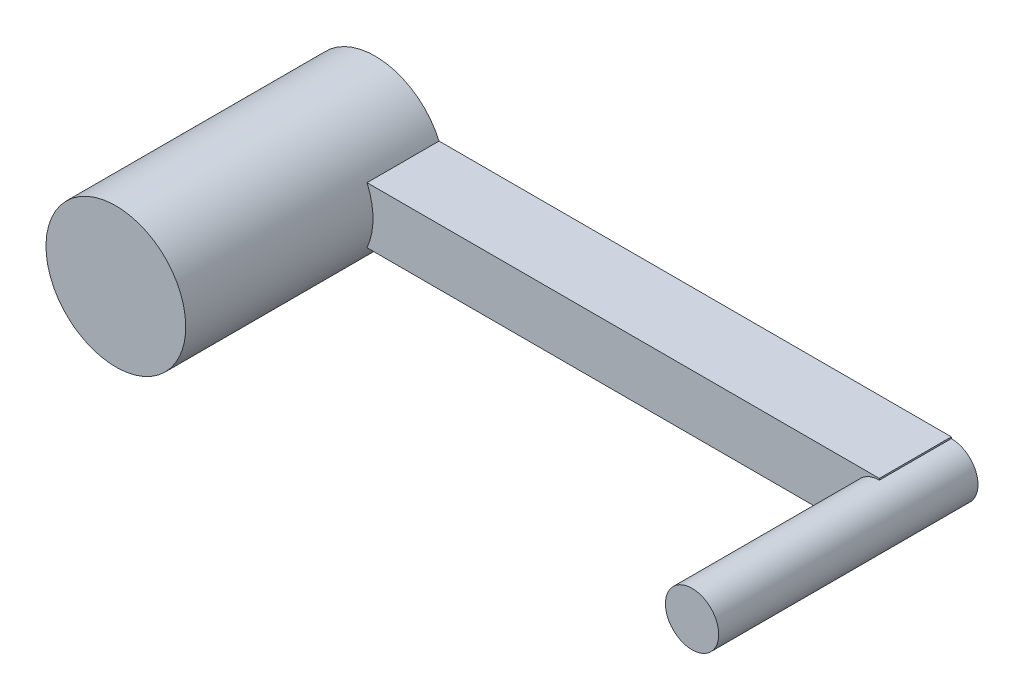
ISO-10303-21;
HEADER;
FILE_DESCRIPTION(('STEP AP214'),'2;1');
FILE_NAME('part.step','',(''),(''),'','','');
FILE_SCHEMA(('AUTOMOTIVE_DESIGN { 1 0 10303 214 1 1 1 1 }'));
ENDSEC;
DATA;
#1=APPLICATION_CONTEXT('core data for automotive mechanical design processes');
#2=APPLICATION_PROTOCOL_DEFINITION('international standard','automotive_design',2000,#1);
#3=PRODUCT_CONTEXT('',#1,'mechanical');
#4=PRODUCT('Part','Part','',(#3));
#5=PRODUCT_RELATED_PRODUCT_CATEGORY('part','',(#4));
#6=PRODUCT_DEFINITION_FORMATION('','',#4);
#7=PRODUCT_DEFINITION_CONTEXT('part definition',#1,'design');
#8=PRODUCT_DEFINITION('design','',#6,#7);
#9=PRODUCT_DEFINITION_SHAPE('','',#8);
#10=(LENGTH_UNIT() NAMED_UNIT(*) SI_UNIT(.MILLI.,.METRE.));
#11=(NAMED_UNIT(*) PLANE_ANGLE_UNIT() SI_UNIT($,.RADIAN.));
#12=(NAMED_UNIT(*) SI_UNIT($,.STERADIAN.) SOLID_ANGLE_UNIT());
#13=UNCERTAINTY_MEASURE_WITH_UNIT(LENGTH_MEASURE(1.E-05),#10,'distance_accuracy_value','');
#14=(GEOMETRIC_REPRESENTATION_CONTEXT(3) GLOBAL_UNCERTAINTY_ASSIGNED_CONTEXT((#13)) GLOBAL_UNIT_ASSIGNED_CONTEXT((#10,
#11,#12)) REPRESENTATION_CONTEXT('',''));
#15=CARTESIAN_POINT('',(0.,0.,0.));
#16=DIRECTION('',(0.,0.,1.));
#17=DIRECTION('',(1.,0.,0.));
#18=AXIS2_PLACEMENT_3D('',#15,#16,#17);
#19=CARTESIAN_POINT('',(40.,0.,5.));
#20=DIRECTION('',(1.,0.,0.));
#21=DIRECTION('',(0.,0.,-1.));
#22=AXIS2_PLACEMENT_3D('',#19,#20,#21);
#23=PLANE('',#22);
#24=DIRECTION('',(0.,-1.,0.));
#25=VECTOR('',#24,1.);
#26=CARTESIAN_POINT('',(40.,0.,0.));
#27=LINE('',#26,#25);
#28=CARTESIAN_POINT('',(40.,0.,0.));
#29=VERTEX_POINT('',#28);
#30=CARTESIAN_POINT('',(40.,-0.106521739130443,0.));
#31=VERTEX_POINT('',#30);
#32=EDGE_CURVE('E97',#29,#31,#27,.T.);
#33=ORIENTED_EDGE('',*,*,#32,.F.);
#34=DIRECTION('',(0.,0.,-1.));
#35=VECTOR('',#34,1.);
#36=CARTESIAN_POINT('',(40.,0.,5.));
#37=LINE('',#36,#35);
#38=CARTESIAN_POINT('',(40.,0.,5.));
#39=VERTEX_POINT('',#38);
#40=EDGE_CURVE('E57',#39,#29,#37,.T.);
#41=ORIENTED_EDGE('',*,*,#40,.F.);
#42=DIRECTION('',(0.,-1.,0.));
#43=VECTOR('',#42,1.);
#44=CARTESIAN_POINT('',(40.,0.,5.));
#45=LINE('',#44,#43);
#46=CARTESIAN_POINT('',(40.,-0.106521739130443,5.));
#47=VERTEX_POINT('',#46);
#48=EDGE_CURVE('E120',#39,#47,#45,.T.);
#49=ORIENTED_EDGE('',*,*,#48,.T.);
#50=DIRECTION('',(0.,0.,-1.));
#51=VECTOR('',#50,1.);
#52=CARTESIAN_POINT('',(40.,-0.106521739130443,5.));
#53=LINE('',#52,#51);
#54=EDGE_CURVE('E11',#47,#31,#53,.T.);
#55=ORIENTED_EDGE('',*,*,#54,.T.);
#56=EDGE_LOOP('',(#33,#41,#49,#55));
#57=FACE_BOUND('',#56,.T.);
#58=ADVANCED_FACE('F47',(#57),#23,.T.);
#59=CARTESIAN_POINT('',(0.,0.,5.));
#60=DIRECTION('',(0.,1.,0.));
#61=DIRECTION('',(0.,0.,1.));
#62=AXIS2_PLACEMENT_3D('',#59,#60,#61);
#63=PLANE('',#62);
#64=DIRECTION('',(1.,0.,0.));
#65=VECTOR('',#64,1.);
#66=CARTESIAN_POINT('',(0.,0.,0.));
#67=LINE('',#66,#65);
#68=CARTESIAN_POINT('',(4.43785113363551,0.,0.));
#69=VERTEX_POINT('',#68);
#70=EDGE_CURVE('E122',#69,#29,#67,.T.);
#71=ORIENTED_EDGE('',*,*,#70,.F.);
#72=DIRECTION('',(0.,0.,-1.));
#73=VECTOR('',#72,1.);
#74=CARTESIAN_POINT('',(4.43785113363551,0.,5.));
#75=LINE('',#74,#73);
#76=CARTESIAN_POINT('',(4.43785113363551,0.,5.));
#77=VERTEX_POINT('',#76);
#78=EDGE_CURVE('E174',#77,#69,#75,.T.);
#79=ORIENTED_EDGE('',*,*,#78,.F.);
#80=DIRECTION('',(1.,0.,0.));
#81=VECTOR('',#80,1.);
#82=CARTESIAN_POINT('',(0.,0.,5.));
#83=LINE('',#82,#81);
#84=EDGE_CURVE('E145',#77,#39,#83,.T.);
#85=ORIENTED_EDGE('',*,*,#84,.T.);
#86=ORIENTED_EDGE('',*,*,#40,.T.);
#87=EDGE_LOOP('',(#71,#79,#85,#86));
#88=FACE_BOUND('',#87,.T.);
#89=ADVANCED_FACE('F49',(#88),#63,.T.);
#90=CARTESIAN_POINT('',(0.,-3.91304347826088,5.));
#91=DIRECTION('',(0.,1.,0.));
#92=DIRECTION('',(0.,0.,1.));
#93=AXIS2_PLACEMENT_3D('',#90,#91,#92);
#94=PLANE('',#93);
#95=DIRECTION('',(1.,0.,0.));
#96=VECTOR('',#95,1.);
#97=CARTESIAN_POINT('',(0.,-3.91304347826088,0.));
#98=LINE('',#97,#96);
#99=CARTESIAN_POINT('',(4.43785113363551,-3.91304347826088,0.));
#100=VERTEX_POINT('',#99);
#101=CARTESIAN_POINT('',(40.,-3.91304347826088,0.));
#102=VERTEX_POINT('',#101);
#103=EDGE_CURVE('E116',#100,#102,#98,.T.);
#104=ORIENTED_EDGE('',*,*,#103,.T.);
#105=DIRECTION('',(0.,0.,-1.));
#106=VECTOR('',#105,1.);
#107=CARTESIAN_POINT('',(40.,-3.91304347826088,5.));
#108=LINE('',#107,#106);
#109=CARTESIAN_POINT('',(40.,-3.91304347826088,5.));
#110=VERTEX_POINT('',#109);
#111=EDGE_CURVE('E82',#110,#102,#108,.T.);
#112=ORIENTED_EDGE('',*,*,#111,.F.);
#113=DIRECTION('',(1.,0.,0.));
#114=VECTOR('',#113,1.);
#115=CARTESIAN_POINT('',(0.,-3.91304347826088,5.));
#116=LINE('',#115,#114);
#117=CARTESIAN_POINT('',(4.43785113363551,-3.91304347826088,5.));
#118=VERTEX_POINT('',#117);
#119=EDGE_CURVE('E65',#118,#110,#116,.T.);
#120=ORIENTED_EDGE('',*,*,#119,.F.);
#121=DIRECTION('',(0.,0.,-1.));
#122=VECTOR('',#121,1.);
#123=CARTESIAN_POINT('',(4.43785113363551,-3.91304347826088,5.));
#124=LINE('',#123,#122);
#125=EDGE_CURVE('E167',#118,#100,#124,.T.);
#126=ORIENTED_EDGE('',*,*,#125,.T.);
#127=EDGE_LOOP('',(#104,#112,#120,#126));
#128=FACE_BOUND('',#127,.T.);
#129=ADVANCED_FACE('F176',(#128),#94,.F.);
#130=CARTESIAN_POINT('',(40.,-3.80652173913044,0.));
#131=VERTEX_POINT('',#130);
#132=EDGE_CURVE('E93',#131,#102,#27,.T.);
#133=ORIENTED_EDGE('',*,*,#132,.F.);
#134=DIRECTION('',(0.,0.,-1.));
#135=VECTOR('',#134,1.);
#136=CARTESIAN_POINT('',(40.,-3.80652173913044,5.));
#137=LINE('',#136,#135);
#138=CARTESIAN_POINT('',(40.,-3.80652173913044,5.));
#139=VERTEX_POINT('',#138);
#140=EDGE_CURVE('E105',#139,#131,#137,.T.);
#141=ORIENTED_EDGE('',*,*,#140,.F.);
#142=EDGE_CURVE('E112',#139,#110,#45,.T.);
#143=ORIENTED_EDGE('',*,*,#142,.T.);
#144=ORIENTED_EDGE('',*,*,#111,.T.);
#145=EDGE_LOOP('',(#133,#141,#143,#144));
#146=FACE_BOUND('',#145,.T.);
#147=ADVANCED_FACE('F114',(#146),#23,.T.);
#148=CARTESIAN_POINT('',(0.,0.,5.));
#149=DIRECTION('',(0.,0.,1.));
#150=DIRECTION('',(1.,0.,0.));
#151=AXIS2_PLACEMENT_3D('',#148,#149,#150);
#152=PLANE('',#151);
#153=CARTESIAN_POINT('',(40.,-1.95652173913044,5.));
#154=DIRECTION('',(0.,0.,1.));
#155=DIRECTION('',(1.,0.,0.));
#156=AXIS2_PLACEMENT_3D('',#153,#154,#155);
#157=CIRCLE('',#156,1.85);
#158=EDGE_CURVE('E110',#47,#139,#157,.T.);
#159=ORIENTED_EDGE('',*,*,#158,.F.);
#160=ORIENTED_EDGE('',*,*,#48,.F.);
#161=ORIENTED_EDGE('',*,*,#84,.F.);
#162=CARTESIAN_POINT('',(0.,-1.95652173913044,5.));
#163=DIRECTION('',(0.,0.,1.));
#164=DIRECTION('',(1.,0.,0.));
#165=AXIS2_PLACEMENT_3D('',#162,#163,#164);
#166=CIRCLE('',#165,4.85);
#167=EDGE_CURVE('E149',#118,#77,#166,.T.);
#168=ORIENTED_EDGE('',*,*,#167,.F.);
#169=ORIENTED_EDGE('',*,*,#119,.T.);
#170=ORIENTED_EDGE('',*,*,#142,.F.);
#171=EDGE_LOOP('',(#159,#160,#161,#168,#169,#170));
#172=FACE_BOUND('',#171,.T.);
#173=ADVANCED_FACE('F154',(#172),#152,.T.);
#174=CARTESIAN_POINT('',(0.,0.,0.));
#175=DIRECTION('',(0.,0.,1.));
#176=DIRECTION('',(1.,0.,0.));
#177=AXIS2_PLACEMENT_3D('',#174,#175,#176);
#178=PLANE('',#177);
#179=ORIENTED_EDGE('',*,*,#32,.T.);
#180=CARTESIAN_POINT('',(40.,-1.95652173913044,0.));
#181=DIRECTION('',(0.,0.,1.));
#182=DIRECTION('',(1.,0.,0.));
#183=AXIS2_PLACEMENT_3D('',#180,#181,#182);
#184=CIRCLE('',#183,1.85);
#185=EDGE_CURVE('E89',#131,#31,#184,.T.);
#186=ORIENTED_EDGE('',*,*,#185,.F.);
#187=ORIENTED_EDGE('',*,*,#132,.T.);
#188=ORIENTED_EDGE('',*,*,#103,.F.);
#189=CARTESIAN_POINT('',(0.,-1.95652173913044,0.));
#190=DIRECTION('',(0.,0.,1.));
#191=DIRECTION('',(1.,0.,0.));
#192=AXIS2_PLACEMENT_3D('',#189,#190,#191);
#193=CIRCLE('',#192,4.85);
#194=EDGE_CURVE('E131',#69,#100,#193,.T.);
#195=ORIENTED_EDGE('',*,*,#194,.F.);
#196=ORIENTED_EDGE('',*,*,#70,.T.);
#197=EDGE_LOOP('',(#179,#186,#187,#188,#195,#196));
#198=FACE_BOUND('',#197,.T.);
#199=ADVANCED_FACE('F91',(#198),#178,.F.);
#200=CARTESIAN_POINT('',(40.,-1.95652173913044,18.));
#201=DIRECTION('',(0.,0.,-1.));
#202=DIRECTION('',(-1.,0.,0.));
#203=AXIS2_PLACEMENT_3D('',#200,#201,#202);
#204=CYLINDRICAL_SURFACE('',#203,1.85);
#205=ORIENTED_EDGE('',*,*,#54,.F.);
#206=ORIENTED_EDGE('',*,*,#158,.T.);
#207=ORIENTED_EDGE('',*,*,#140,.T.);
#208=ORIENTED_EDGE('',*,*,#185,.T.);
#209=EDGE_LOOP('',(#205,#206,#207,#208));
#210=FACE_BOUND('',#209,.T.);
#211=CARTESIAN_POINT('',(40.,-1.95652173913044,18.));
#212=DIRECTION('',(0.,0.,1.));
#213=DIRECTION('',(1.,0.,0.));
#214=AXIS2_PLACEMENT_3D('',#211,#212,#213);
#215=CIRCLE('',#214,1.85);
#216=CARTESIAN_POINT('',(41.85,-1.95652173913044,18.));
#217=VERTEX_POINT('',#216);
#218=EDGE_CURVE('E101',#217,#217,#215,.T.);
#219=ORIENTED_EDGE('',*,*,#218,.F.);
#220=EDGE_LOOP('',(#219));
#221=FACE_BOUND('',#220,.T.);
#222=ADVANCED_FACE('F106',(#210,#221),#204,.T.);
#223=CARTESIAN_POINT('',(0.,0.,18.));
#224=DIRECTION('',(0.,0.,1.));
#225=DIRECTION('',(1.,0.,0.));
#226=AXIS2_PLACEMENT_3D('',#223,#224,#225);
#227=PLANE('',#226);
#228=ORIENTED_EDGE('',*,*,#218,.T.);
#229=EDGE_LOOP('',(#228));
#230=FACE_BOUND('',#229,.T.);
#231=ADVANCED_FACE('F236',(#230),#227,.T.);
#232=CARTESIAN_POINT('',(0.,-1.95652173913044,18.));
#233=DIRECTION('',(0.,0.,-1.));
#234=DIRECTION('',(-1.,0.,0.));
#235=AXIS2_PLACEMENT_3D('',#232,#233,#234);
#236=CYLINDRICAL_SURFACE('',#235,4.85);
#237=ORIENTED_EDGE('',*,*,#78,.T.);
#238=ORIENTED_EDGE('',*,*,#194,.T.);
#239=ORIENTED_EDGE('',*,*,#125,.F.);
#240=ORIENTED_EDGE('',*,*,#167,.T.);
#241=EDGE_LOOP('',(#237,#238,#239,#240));
#242=FACE_BOUND('',#241,.T.);
#243=CARTESIAN_POINT('',(0.,-1.95652173913044,18.));
#244=DIRECTION('',(0.,0.,1.));
#245=DIRECTION('',(1.,0.,0.));
#246=AXIS2_PLACEMENT_3D('',#243,#244,#245);
#247=CIRCLE('',#246,4.85);
#248=CARTESIAN_POINT('',(4.85,-1.95652173913044,18.));
#249=VERTEX_POINT('',#248);
#250=EDGE_CURVE('E127',#249,#249,#247,.T.);
#251=ORIENTED_EDGE('',*,*,#250,.F.);
#252=EDGE_LOOP('',(#251));
#253=FACE_BOUND('',#252,.T.);
#254=ADVANCED_FACE('F169',(#242,#253),#236,.T.);
#255=CARTESIAN_POINT('',(0.,0.,18.));
#256=DIRECTION('',(0.,0.,1.));
#257=DIRECTION('',(1.,0.,0.));
#258=AXIS2_PLACEMENT_3D('',#255,#256,#257);
#259=PLANE('',#258);
#260=ORIENTED_EDGE('',*,*,#250,.T.);
#261=EDGE_LOOP('',(#260));
#262=FACE_BOUND('',#261,.T.);
#263=ADVANCED_FACE('F254',(#262),#259,.T.);
#264=CLOSED_SHELL('',(#58,#89,#129,#147,#173,#199,#222,#231,#254,#263));
#265=MANIFOLD_SOLID_BREP('B2',#264);
#266=ADVANCED_BREP_SHAPE_REPRESENTATION('',(#18,#265),#14);
#267=SHAPE_DEFINITION_REPRESENTATION(#9,#266);
ENDSEC;
END-ISO-10303-21;
